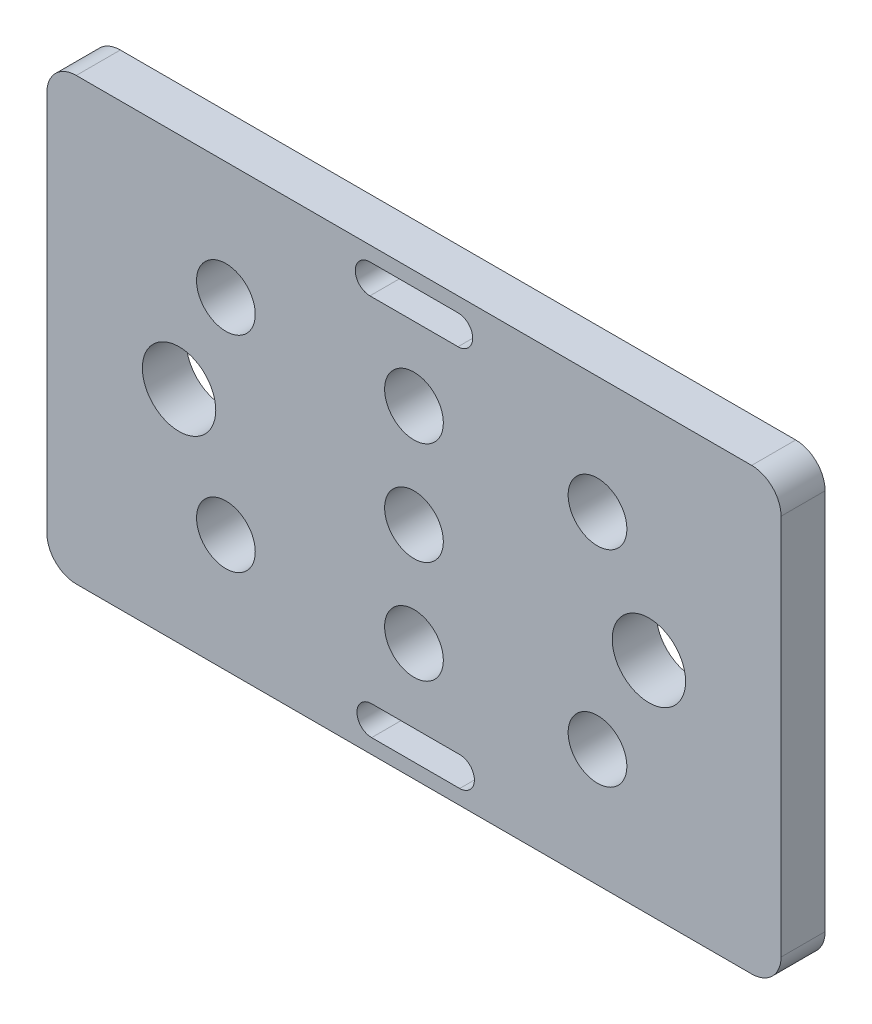
ISO-10303-21;
HEADER;
FILE_DESCRIPTION(('STEP AP214'),'2;1');
FILE_NAME('part.step','',(''),(''),'','','');
FILE_SCHEMA(('AUTOMOTIVE_DESIGN { 1 0 10303 214 1 1 1 1 }'));
ENDSEC;
DATA;
#1=APPLICATION_CONTEXT('core data for automotive mechanical design processes');
#2=APPLICATION_PROTOCOL_DEFINITION('international standard','automotive_design',2000,#1);
#3=PRODUCT_CONTEXT('',#1,'mechanical');
#4=PRODUCT('Part','Part','',(#3));
#5=PRODUCT_RELATED_PRODUCT_CATEGORY('part','',(#4));
#6=PRODUCT_DEFINITION_FORMATION('','',#4);
#7=PRODUCT_DEFINITION_CONTEXT('part definition',#1,'design');
#8=PRODUCT_DEFINITION('design','',#6,#7);
#9=PRODUCT_DEFINITION_SHAPE('','',#8);
#10=(LENGTH_UNIT() NAMED_UNIT(*) SI_UNIT(.MILLI.,.METRE.));
#11=(NAMED_UNIT(*) PLANE_ANGLE_UNIT() SI_UNIT($,.RADIAN.));
#12=(NAMED_UNIT(*) SI_UNIT($,.STERADIAN.) SOLID_ANGLE_UNIT());
#13=UNCERTAINTY_MEASURE_WITH_UNIT(LENGTH_MEASURE(1.E-05),#10,'distance_accuracy_value','');
#14=(GEOMETRIC_REPRESENTATION_CONTEXT(3) GLOBAL_UNCERTAINTY_ASSIGNED_CONTEXT((#13)) GLOBAL_UNIT_ASSIGNED_CONTEXT((#10,
#11,#12)) REPRESENTATION_CONTEXT('',''));
#15=CARTESIAN_POINT('',(0.,0.,0.));
#16=DIRECTION('',(0.,0.,1.));
#17=DIRECTION('',(1.,0.,0.));
#18=AXIS2_PLACEMENT_3D('',#15,#16,#17);
#19=CARTESIAN_POINT('',(-2.,28.,3.));
#20=DIRECTION('',(0.,0.,1.));
#21=DIRECTION('',(1.,0.,0.));
#22=AXIS2_PLACEMENT_3D('',#19,#20,#21);
#23=PLANE('',#22);
#24=CARTESIAN_POINT('',(-8.99999999999998,15.,3.));
#25=DIRECTION('',(0.,0.,1.));
#26=DIRECTION('',(1.,0.,0.));
#27=AXIS2_PLACEMENT_3D('',#24,#25,#26);
#28=CIRCLE('',#27,2.5);
#29=CARTESIAN_POINT('',(-6.49999999999998,15.,3.));
#30=VERTEX_POINT('',#29);
#31=EDGE_CURVE('E222',#30,#30,#28,.T.);
#32=ORIENTED_EDGE('',*,*,#31,.F.);
#33=EDGE_LOOP('',(#32));
#34=FACE_BOUND('',#33,.T.);
#35=CARTESIAN_POINT('',(-25.,8.,3.));
#36=DIRECTION('',(0.,0.,1.));
#37=DIRECTION('',(1.,0.,0.));
#38=AXIS2_PLACEMENT_3D('',#35,#36,#37);
#39=CIRCLE('',#38,2.);
#40=CARTESIAN_POINT('',(-23.,8.,3.));
#41=VERTEX_POINT('',#40);
#42=EDGE_CURVE('E234',#41,#41,#39,.T.);
#43=ORIENTED_EDGE('',*,*,#42,.F.);
#44=EDGE_LOOP('',(#43));
#45=FACE_BOUND('',#44,.T.);
#46=CARTESIAN_POINT('',(-37.8100565099745,22.,3.));
#47=DIRECTION('',(0.,0.,1.));
#48=DIRECTION('',(1.,0.,0.));
#49=AXIS2_PLACEMENT_3D('',#46,#47,#48);
#50=CIRCLE('',#49,2.);
#51=CARTESIAN_POINT('',(-35.8100565099745,22.,3.));
#52=VERTEX_POINT('',#51);
#53=EDGE_CURVE('E246',#52,#52,#50,.T.);
#54=ORIENTED_EDGE('',*,*,#53,.F.);
#55=EDGE_LOOP('',(#54));
#56=FACE_BOUND('',#55,.T.);
#57=CARTESIAN_POINT('',(-37.8100565099745,7.99999999999999,3.));
#58=DIRECTION('',(0.,0.,1.));
#59=DIRECTION('',(1.,0.,0.));
#60=AXIS2_PLACEMENT_3D('',#57,#58,#59);
#61=CIRCLE('',#60,2.);
#62=CARTESIAN_POINT('',(-35.8100565099745,7.99999999999999,3.));
#63=VERTEX_POINT('',#62);
#64=EDGE_CURVE('E258',#63,#63,#61,.T.);
#65=ORIENTED_EDGE('',*,*,#64,.F.);
#66=EDGE_LOOP('',(#65));
#67=FACE_BOUND('',#66,.T.);
#68=CARTESIAN_POINT('',(-2.,28.,3.));
#69=DIRECTION('',(0.,0.,1.));
#70=DIRECTION('',(1.,0.,0.));
#71=AXIS2_PLACEMENT_3D('',#68,#69,#70);
#72=CIRCLE('',#71,2.);
#73=CARTESIAN_POINT('',(0.,28.,3.));
#74=VERTEX_POINT('',#73);
#75=CARTESIAN_POINT('',(-2.,30.,3.));
#76=VERTEX_POINT('',#75);
#77=EDGE_CURVE('E270',#74,#76,#72,.T.);
#78=ORIENTED_EDGE('',*,*,#77,.T.);
#79=DIRECTION('',(-1.,0.,0.));
#80=VECTOR('',#79,1.);
#81=CARTESIAN_POINT('',(-2.,30.,3.));
#82=LINE('',#81,#80);
#83=CARTESIAN_POINT('',(-48.,30.,3.));
#84=VERTEX_POINT('',#83);
#85=EDGE_CURVE('E273',#76,#84,#82,.T.);
#86=ORIENTED_EDGE('',*,*,#85,.T.);
#87=CARTESIAN_POINT('',(-48.,28.,3.));
#88=DIRECTION('',(0.,0.,1.));
#89=DIRECTION('',(1.,0.,0.));
#90=AXIS2_PLACEMENT_3D('',#87,#88,#89);
#91=CIRCLE('',#90,2.00000000000001);
#92=CARTESIAN_POINT('',(-50.,28.,3.));
#93=VERTEX_POINT('',#92);
#94=EDGE_CURVE('E276',#84,#93,#91,.T.);
#95=ORIENTED_EDGE('',*,*,#94,.T.);
#96=DIRECTION('',(0.,-1.,0.));
#97=VECTOR('',#96,1.);
#98=CARTESIAN_POINT('',(-50.,28.,3.));
#99=LINE('',#98,#97);
#100=CARTESIAN_POINT('',(-50.,1.99999999999997,3.));
#101=VERTEX_POINT('',#100);
#102=EDGE_CURVE('E278',#93,#101,#99,.T.);
#103=ORIENTED_EDGE('',*,*,#102,.T.);
#104=CARTESIAN_POINT('',(-48.,1.99999999999998,3.));
#105=DIRECTION('',(0.,0.,1.));
#106=DIRECTION('',(1.,0.,0.));
#107=AXIS2_PLACEMENT_3D('',#104,#105,#106);
#108=CIRCLE('',#107,2.00000000000001);
#109=CARTESIAN_POINT('',(-48.,0.,3.));
#110=VERTEX_POINT('',#109);
#111=EDGE_CURVE('E280',#101,#110,#108,.T.);
#112=ORIENTED_EDGE('',*,*,#111,.T.);
#113=DIRECTION('',(1.,0.,0.));
#114=VECTOR('',#113,1.);
#115=CARTESIAN_POINT('',(-48.,0.,3.));
#116=LINE('',#115,#114);
#117=CARTESIAN_POINT('',(-2.,0.,3.));
#118=VERTEX_POINT('',#117);
#119=EDGE_CURVE('E282',#110,#118,#116,.T.);
#120=ORIENTED_EDGE('',*,*,#119,.T.);
#121=CARTESIAN_POINT('',(-2.,2.,3.));
#122=DIRECTION('',(0.,0.,1.));
#123=DIRECTION('',(1.,0.,0.));
#124=AXIS2_PLACEMENT_3D('',#121,#122,#123);
#125=CIRCLE('',#124,2.);
#126=CARTESIAN_POINT('',(0.,2.,3.));
#127=VERTEX_POINT('',#126);
#128=EDGE_CURVE('E284',#118,#127,#125,.T.);
#129=ORIENTED_EDGE('',*,*,#128,.T.);
#130=DIRECTION('',(0.,1.,0.));
#131=VECTOR('',#130,1.);
#132=CARTESIAN_POINT('',(0.,2.,3.));
#133=LINE('',#132,#131);
#134=EDGE_CURVE('E286',#127,#74,#133,.T.);
#135=ORIENTED_EDGE('',*,*,#134,.T.);
#136=EDGE_LOOP('',(#78,#86,#95,#103,#112,#120,#129,#135));
#137=FACE_BOUND('',#136,.T.);
#138=CARTESIAN_POINT('',(-25.,15.,3.));
#139=DIRECTION('',(0.,0.,1.));
#140=DIRECTION('',(1.,0.,0.));
#141=AXIS2_PLACEMENT_3D('',#138,#139,#140);
#142=CIRCLE('',#141,2.);
#143=CARTESIAN_POINT('',(-23.,15.,3.));
#144=VERTEX_POINT('',#143);
#145=EDGE_CURVE('E264',#144,#144,#142,.T.);
#146=ORIENTED_EDGE('',*,*,#145,.F.);
#147=EDGE_LOOP('',(#146));
#148=FACE_BOUND('',#147,.T.);
#149=CARTESIAN_POINT('',(-12.5,7.99999999999999,3.));
#150=DIRECTION('',(0.,0.,1.));
#151=DIRECTION('',(1.,0.,0.));
#152=AXIS2_PLACEMENT_3D('',#149,#150,#151);
#153=CIRCLE('',#152,2.);
#154=CARTESIAN_POINT('',(-10.5,7.99999999999999,3.));
#155=VERTEX_POINT('',#154);
#156=EDGE_CURVE('E252',#155,#155,#153,.T.);
#157=ORIENTED_EDGE('',*,*,#156,.F.);
#158=EDGE_LOOP('',(#157));
#159=FACE_BOUND('',#158,.T.);
#160=CARTESIAN_POINT('',(-12.5,22.,3.));
#161=DIRECTION('',(0.,0.,1.));
#162=DIRECTION('',(1.,0.,0.));
#163=AXIS2_PLACEMENT_3D('',#160,#161,#162);
#164=CIRCLE('',#163,2.);
#165=CARTESIAN_POINT('',(-10.5,22.,3.));
#166=VERTEX_POINT('',#165);
#167=EDGE_CURVE('E240',#166,#166,#164,.T.);
#168=ORIENTED_EDGE('',*,*,#167,.F.);
#169=EDGE_LOOP('',(#168));
#170=FACE_BOUND('',#169,.T.);
#171=CARTESIAN_POINT('',(-25.,22.,3.));
#172=DIRECTION('',(0.,0.,1.));
#173=DIRECTION('',(1.,0.,0.));
#174=AXIS2_PLACEMENT_3D('',#171,#172,#173);
#175=CIRCLE('',#174,2.);
#176=CARTESIAN_POINT('',(-23.,22.,3.));
#177=VERTEX_POINT('',#176);
#178=EDGE_CURVE('E228',#177,#177,#175,.T.);
#179=ORIENTED_EDGE('',*,*,#178,.F.);
#180=EDGE_LOOP('',(#179));
#181=FACE_BOUND('',#180,.T.);
#182=CARTESIAN_POINT('',(-41.,15.,3.));
#183=DIRECTION('',(0.,0.,1.));
#184=DIRECTION('',(1.,0.,0.));
#185=AXIS2_PLACEMENT_3D('',#182,#183,#184);
#186=CIRCLE('',#185,2.5);
#187=CARTESIAN_POINT('',(-38.5,15.,3.));
#188=VERTEX_POINT('',#187);
#189=EDGE_CURVE('E216',#188,#188,#186,.T.);
#190=ORIENTED_EDGE('',*,*,#189,.F.);
#191=EDGE_LOOP('',(#190));
#192=FACE_BOUND('',#191,.T.);
#193=DIRECTION('',(-1.,0.,0.));
#194=VECTOR('',#193,1.);
#195=CARTESIAN_POINT('',(-27.8847716320629,2.99999999999998,3.));
#196=LINE('',#195,#194);
#197=CARTESIAN_POINT('',(-21.8847716320629,2.99999999999999,3.));
#198=VERTEX_POINT('',#197);
#199=CARTESIAN_POINT('',(-27.8847716320629,2.99999999999998,3.));
#200=VERTEX_POINT('',#199);
#201=EDGE_CURVE('E187',#198,#200,#196,.T.);
#202=ORIENTED_EDGE('',*,*,#201,.F.);
#203=CARTESIAN_POINT('',(-21.8847716320629,1.99999999999999,3.));
#204=DIRECTION('',(0.,0.,1.));
#205=DIRECTION('',(1.,0.,0.));
#206=AXIS2_PLACEMENT_3D('',#203,#204,#205);
#207=CIRCLE('',#206,1.);
#208=CARTESIAN_POINT('',(-21.8847716320629,0.999999999999986,3.));
#209=VERTEX_POINT('',#208);
#210=EDGE_CURVE('E185',#209,#198,#207,.T.);
#211=ORIENTED_EDGE('',*,*,#210,.F.);
#212=DIRECTION('',(1.,0.,0.));
#213=VECTOR('',#212,1.);
#214=CARTESIAN_POINT('',(-21.8847716320629,0.999999999999986,3.));
#215=LINE('',#214,#213);
#216=CARTESIAN_POINT('',(-27.8847716320629,0.999999999999982,3.));
#217=VERTEX_POINT('',#216);
#218=EDGE_CURVE('E193',#217,#209,#215,.T.);
#219=ORIENTED_EDGE('',*,*,#218,.F.);
#220=CARTESIAN_POINT('',(-27.8847716320629,1.99999999999998,3.));
#221=DIRECTION('',(0.,0.,1.));
#222=DIRECTION('',(1.,0.,0.));
#223=AXIS2_PLACEMENT_3D('',#220,#221,#222);
#224=CIRCLE('',#223,1.);
#225=EDGE_CURVE('E190',#200,#217,#224,.T.);
#226=ORIENTED_EDGE('',*,*,#225,.F.);
#227=EDGE_LOOP('',(#202,#211,#219,#226));
#228=FACE_BOUND('',#227,.T.);
#229=DIRECTION('',(1.,0.,0.));
#230=VECTOR('',#229,1.);
#231=CARTESIAN_POINT('',(-22.,26.9998281085365,3.));
#232=LINE('',#231,#230);
#233=CARTESIAN_POINT('',(-28.,26.9998281085365,3.));
#234=VERTEX_POINT('',#233);
#235=CARTESIAN_POINT('',(-22.,26.9998281085365,3.));
#236=VERTEX_POINT('',#235);
#237=EDGE_CURVE('E157',#234,#236,#232,.T.);
#238=ORIENTED_EDGE('',*,*,#237,.F.);
#239=CARTESIAN_POINT('',(-28.,27.9998281085365,3.));
#240=DIRECTION('',(0.,0.,1.));
#241=DIRECTION('',(1.,0.,0.));
#242=AXIS2_PLACEMENT_3D('',#239,#240,#241);
#243=CIRCLE('',#242,0.999999999999994);
#244=CARTESIAN_POINT('',(-28.,28.9998281085365,3.));
#245=VERTEX_POINT('',#244);
#246=EDGE_CURVE('E149',#245,#234,#243,.T.);
#247=ORIENTED_EDGE('',*,*,#246,.F.);
#248=DIRECTION('',(-1.,0.,0.));
#249=VECTOR('',#248,1.);
#250=CARTESIAN_POINT('',(-28.,28.9998281085365,3.));
#251=LINE('',#250,#249);
#252=CARTESIAN_POINT('',(-22.,28.9998281085365,3.));
#253=VERTEX_POINT('',#252);
#254=EDGE_CURVE('E171',#253,#245,#251,.T.);
#255=ORIENTED_EDGE('',*,*,#254,.F.);
#256=CARTESIAN_POINT('',(-22.,27.9998281085365,3.));
#257=DIRECTION('',(0.,0.,1.));
#258=DIRECTION('',(1.,0.,0.));
#259=AXIS2_PLACEMENT_3D('',#256,#257,#258);
#260=CIRCLE('',#259,1.);
#261=EDGE_CURVE('E169',#236,#253,#260,.T.);
#262=ORIENTED_EDGE('',*,*,#261,.F.);
#263=EDGE_LOOP('',(#238,#247,#255,#262));
#264=FACE_BOUND('',#263,.T.);
#265=ADVANCED_FACE('F36',(#34,#45,#56,#67,#137,#148,#159,#170,#181,#192,#228,#264),#23,.T.);
#266=CARTESIAN_POINT('',(-2.,28.,0.));
#267=DIRECTION('',(0.,0.,1.));
#268=DIRECTION('',(1.,0.,0.));
#269=AXIS2_PLACEMENT_3D('',#266,#267,#268);
#270=PLANE('',#269);
#271=CARTESIAN_POINT('',(-21.8847716320629,1.99999999999999,0.));
#272=DIRECTION('',(0.,0.,1.));
#273=DIRECTION('',(1.,0.,0.));
#274=AXIS2_PLACEMENT_3D('',#271,#272,#273);
#275=CIRCLE('',#274,1.);
#276=CARTESIAN_POINT('',(-21.8847716320629,0.999999999999987,0.));
#277=VERTEX_POINT('',#276);
#278=CARTESIAN_POINT('',(-21.8847716320629,2.99999999999999,0.));
#279=VERTEX_POINT('',#278);
#280=EDGE_CURVE('E165',#277,#279,#275,.T.);
#281=ORIENTED_EDGE('',*,*,#280,.T.);
#282=DIRECTION('',(-1.,0.,0.));
#283=VECTOR('',#282,1.);
#284=CARTESIAN_POINT('',(-27.8847716320629,2.99999999999998,0.));
#285=LINE('',#284,#283);
#286=CARTESIAN_POINT('',(-27.8847716320629,2.99999999999998,0.));
#287=VERTEX_POINT('',#286);
#288=EDGE_CURVE('E198',#279,#287,#285,.T.);
#289=ORIENTED_EDGE('',*,*,#288,.T.);
#290=CARTESIAN_POINT('',(-27.8847716320629,1.99999999999998,0.));
#291=DIRECTION('',(0.,0.,1.));
#292=DIRECTION('',(1.,0.,0.));
#293=AXIS2_PLACEMENT_3D('',#290,#291,#292);
#294=CIRCLE('',#293,1.);
#295=CARTESIAN_POINT('',(-27.8847716320629,0.999999999999981,0.));
#296=VERTEX_POINT('',#295);
#297=EDGE_CURVE('E201',#287,#296,#294,.T.);
#298=ORIENTED_EDGE('',*,*,#297,.T.);
#299=DIRECTION('',(1.,0.,0.));
#300=VECTOR('',#299,1.);
#301=CARTESIAN_POINT('',(-21.8847716320629,0.999999999999986,0.));
#302=LINE('',#301,#300);
#303=EDGE_CURVE('E188',#296,#277,#302,.T.);
#304=ORIENTED_EDGE('',*,*,#303,.T.);
#305=EDGE_LOOP('',(#281,#289,#298,#304));
#306=FACE_BOUND('',#305,.T.);
#307=CARTESIAN_POINT('',(-2.,28.,0.));
#308=DIRECTION('',(0.,0.,1.));
#309=DIRECTION('',(1.,0.,0.));
#310=AXIS2_PLACEMENT_3D('',#307,#308,#309);
#311=CIRCLE('',#310,2.);
#312=CARTESIAN_POINT('',(0.,28.,0.));
#313=VERTEX_POINT('',#312);
#314=CARTESIAN_POINT('',(-2.,30.,0.));
#315=VERTEX_POINT('',#314);
#316=EDGE_CURVE('E267',#313,#315,#311,.T.);
#317=ORIENTED_EDGE('',*,*,#316,.F.);
#318=DIRECTION('',(0.,1.,0.));
#319=VECTOR('',#318,1.);
#320=CARTESIAN_POINT('',(0.,2.,0.));
#321=LINE('',#320,#319);
#322=CARTESIAN_POINT('',(0.,2.,0.));
#323=VERTEX_POINT('',#322);
#324=EDGE_CURVE('E274',#323,#313,#321,.T.);
#325=ORIENTED_EDGE('',*,*,#324,.F.);
#326=CARTESIAN_POINT('',(-2.,2.,0.));
#327=DIRECTION('',(0.,0.,1.));
#328=DIRECTION('',(1.,0.,0.));
#329=AXIS2_PLACEMENT_3D('',#326,#327,#328);
#330=CIRCLE('',#329,2.);
#331=CARTESIAN_POINT('',(-2.,0.,0.));
#332=VERTEX_POINT('',#331);
#333=EDGE_CURVE('E301',#332,#323,#330,.T.);
#334=ORIENTED_EDGE('',*,*,#333,.F.);
#335=DIRECTION('',(1.,0.,0.));
#336=VECTOR('',#335,1.);
#337=CARTESIAN_POINT('',(-48.,0.,0.));
#338=LINE('',#337,#336);
#339=CARTESIAN_POINT('',(-48.,0.,0.));
#340=VERTEX_POINT('',#339);
#341=EDGE_CURVE('E299',#340,#332,#338,.T.);
#342=ORIENTED_EDGE('',*,*,#341,.F.);
#343=CARTESIAN_POINT('',(-48.,1.99999999999998,0.));
#344=DIRECTION('',(0.,0.,1.));
#345=DIRECTION('',(1.,0.,0.));
#346=AXIS2_PLACEMENT_3D('',#343,#344,#345);
#347=CIRCLE('',#346,2.00000000000001);
#348=CARTESIAN_POINT('',(-50.,1.99999999999997,0.));
#349=VERTEX_POINT('',#348);
#350=EDGE_CURVE('E297',#349,#340,#347,.T.);
#351=ORIENTED_EDGE('',*,*,#350,.F.);
#352=DIRECTION('',(0.,-1.,0.));
#353=VECTOR('',#352,1.);
#354=CARTESIAN_POINT('',(-50.,28.,0.));
#355=LINE('',#354,#353);
#356=CARTESIAN_POINT('',(-50.,28.,0.));
#357=VERTEX_POINT('',#356);
#358=EDGE_CURVE('E295',#357,#349,#355,.T.);
#359=ORIENTED_EDGE('',*,*,#358,.F.);
#360=CARTESIAN_POINT('',(-48.,28.,0.));
#361=DIRECTION('',(0.,0.,1.));
#362=DIRECTION('',(1.,0.,0.));
#363=AXIS2_PLACEMENT_3D('',#360,#361,#362);
#364=CIRCLE('',#363,2.00000000000001);
#365=CARTESIAN_POINT('',(-48.,30.,0.));
#366=VERTEX_POINT('',#365);
#367=EDGE_CURVE('E293',#366,#357,#364,.T.);
#368=ORIENTED_EDGE('',*,*,#367,.F.);
#369=DIRECTION('',(-1.,0.,0.));
#370=VECTOR('',#369,1.);
#371=CARTESIAN_POINT('',(-2.,30.,0.));
#372=LINE('',#371,#370);
#373=EDGE_CURVE('E291',#315,#366,#372,.T.);
#374=ORIENTED_EDGE('',*,*,#373,.F.);
#375=EDGE_LOOP('',(#317,#325,#334,#342,#351,#359,#368,#374));
#376=FACE_BOUND('',#375,.T.);
#377=CARTESIAN_POINT('',(-25.,15.,0.));
#378=DIRECTION('',(0.,0.,1.));
#379=DIRECTION('',(1.,0.,0.));
#380=AXIS2_PLACEMENT_3D('',#377,#378,#379);
#381=CIRCLE('',#380,2.);
#382=CARTESIAN_POINT('',(-23.,15.,0.));
#383=VERTEX_POINT('',#382);
#384=EDGE_CURVE('E261',#383,#383,#381,.T.);
#385=ORIENTED_EDGE('',*,*,#384,.T.);
#386=EDGE_LOOP('',(#385));
#387=FACE_BOUND('',#386,.T.);
#388=CARTESIAN_POINT('',(-37.8100565099745,7.99999999999999,0.));
#389=DIRECTION('',(0.,0.,1.));
#390=DIRECTION('',(1.,0.,0.));
#391=AXIS2_PLACEMENT_3D('',#388,#389,#390);
#392=CIRCLE('',#391,2.);
#393=CARTESIAN_POINT('',(-35.8100565099745,7.99999999999999,0.));
#394=VERTEX_POINT('',#393);
#395=EDGE_CURVE('E255',#394,#394,#392,.T.);
#396=ORIENTED_EDGE('',*,*,#395,.T.);
#397=EDGE_LOOP('',(#396));
#398=FACE_BOUND('',#397,.T.);
#399=CARTESIAN_POINT('',(-12.5,7.99999999999999,0.));
#400=DIRECTION('',(0.,0.,1.));
#401=DIRECTION('',(1.,0.,0.));
#402=AXIS2_PLACEMENT_3D('',#399,#400,#401);
#403=CIRCLE('',#402,2.);
#404=CARTESIAN_POINT('',(-10.5,7.99999999999999,0.));
#405=VERTEX_POINT('',#404);
#406=EDGE_CURVE('E249',#405,#405,#403,.T.);
#407=ORIENTED_EDGE('',*,*,#406,.T.);
#408=EDGE_LOOP('',(#407));
#409=FACE_BOUND('',#408,.T.);
#410=CARTESIAN_POINT('',(-37.8100565099745,22.,0.));
#411=DIRECTION('',(0.,0.,1.));
#412=DIRECTION('',(1.,0.,0.));
#413=AXIS2_PLACEMENT_3D('',#410,#411,#412);
#414=CIRCLE('',#413,2.);
#415=CARTESIAN_POINT('',(-35.8100565099745,22.,0.));
#416=VERTEX_POINT('',#415);
#417=EDGE_CURVE('E243',#416,#416,#414,.T.);
#418=ORIENTED_EDGE('',*,*,#417,.T.);
#419=EDGE_LOOP('',(#418));
#420=FACE_BOUND('',#419,.T.);
#421=CARTESIAN_POINT('',(-12.5,22.,0.));
#422=DIRECTION('',(0.,0.,1.));
#423=DIRECTION('',(1.,0.,0.));
#424=AXIS2_PLACEMENT_3D('',#421,#422,#423);
#425=CIRCLE('',#424,2.);
#426=CARTESIAN_POINT('',(-10.5,22.,0.));
#427=VERTEX_POINT('',#426);
#428=EDGE_CURVE('E237',#427,#427,#425,.T.);
#429=ORIENTED_EDGE('',*,*,#428,.T.);
#430=EDGE_LOOP('',(#429));
#431=FACE_BOUND('',#430,.T.);
#432=CARTESIAN_POINT('',(-25.,8.,0.));
#433=DIRECTION('',(0.,0.,1.));
#434=DIRECTION('',(1.,0.,0.));
#435=AXIS2_PLACEMENT_3D('',#432,#433,#434);
#436=CIRCLE('',#435,2.);
#437=CARTESIAN_POINT('',(-23.,8.,0.));
#438=VERTEX_POINT('',#437);
#439=EDGE_CURVE('E231',#438,#438,#436,.T.);
#440=ORIENTED_EDGE('',*,*,#439,.T.);
#441=EDGE_LOOP('',(#440));
#442=FACE_BOUND('',#441,.T.);
#443=CARTESIAN_POINT('',(-25.,22.,0.));
#444=DIRECTION('',(0.,0.,1.));
#445=DIRECTION('',(1.,0.,0.));
#446=AXIS2_PLACEMENT_3D('',#443,#444,#445);
#447=CIRCLE('',#446,2.);
#448=CARTESIAN_POINT('',(-23.,22.,0.));
#449=VERTEX_POINT('',#448);
#450=EDGE_CURVE('E225',#449,#449,#447,.T.);
#451=ORIENTED_EDGE('',*,*,#450,.T.);
#452=EDGE_LOOP('',(#451));
#453=FACE_BOUND('',#452,.T.);
#454=CARTESIAN_POINT('',(-8.99999999999998,15.,0.));
#455=DIRECTION('',(0.,0.,1.));
#456=DIRECTION('',(1.,0.,0.));
#457=AXIS2_PLACEMENT_3D('',#454,#455,#456);
#458=CIRCLE('',#457,2.5);
#459=CARTESIAN_POINT('',(-6.49999999999998,15.,0.));
#460=VERTEX_POINT('',#459);
#461=EDGE_CURVE('E219',#460,#460,#458,.T.);
#462=ORIENTED_EDGE('',*,*,#461,.T.);
#463=EDGE_LOOP('',(#462));
#464=FACE_BOUND('',#463,.T.);
#465=CARTESIAN_POINT('',(-41.,15.,0.));
#466=DIRECTION('',(0.,0.,1.));
#467=DIRECTION('',(1.,0.,0.));
#468=AXIS2_PLACEMENT_3D('',#465,#466,#467);
#469=CIRCLE('',#468,2.5);
#470=CARTESIAN_POINT('',(-38.5,15.,0.));
#471=VERTEX_POINT('',#470);
#472=EDGE_CURVE('E215',#471,#471,#469,.T.);
#473=ORIENTED_EDGE('',*,*,#472,.T.);
#474=EDGE_LOOP('',(#473));
#475=FACE_BOUND('',#474,.T.);
#476=CARTESIAN_POINT('',(-28.,27.9998281085365,0.));
#477=DIRECTION('',(0.,0.,1.));
#478=DIRECTION('',(1.,0.,0.));
#479=AXIS2_PLACEMENT_3D('',#476,#477,#478);
#480=CIRCLE('',#479,0.999999999999994);
#481=CARTESIAN_POINT('',(-28.,28.9998281085365,0.));
#482=VERTEX_POINT('',#481);
#483=CARTESIAN_POINT('',(-28.,26.9998281085365,0.));
#484=VERTEX_POINT('',#483);
#485=EDGE_CURVE('E59',#482,#484,#480,.T.);
#486=ORIENTED_EDGE('',*,*,#485,.T.);
#487=DIRECTION('',(1.,0.,0.));
#488=VECTOR('',#487,1.);
#489=CARTESIAN_POINT('',(-22.,26.9998281085365,0.));
#490=LINE('',#489,#488);
#491=CARTESIAN_POINT('',(-22.,26.9998281085365,0.));
#492=VERTEX_POINT('',#491);
#493=EDGE_CURVE('E164',#484,#492,#490,.T.);
#494=ORIENTED_EDGE('',*,*,#493,.T.);
#495=CARTESIAN_POINT('',(-22.,27.9998281085365,0.));
#496=DIRECTION('',(0.,0.,1.));
#497=DIRECTION('',(1.,0.,0.));
#498=AXIS2_PLACEMENT_3D('',#495,#496,#497);
#499=CIRCLE('',#498,1.);
#500=CARTESIAN_POINT('',(-22.,28.9998281085365,0.));
#501=VERTEX_POINT('',#500);
#502=EDGE_CURVE('E177',#492,#501,#499,.T.);
#503=ORIENTED_EDGE('',*,*,#502,.T.);
#504=DIRECTION('',(-1.,0.,0.));
#505=VECTOR('',#504,1.);
#506=CARTESIAN_POINT('',(-28.,28.9998281085365,0.));
#507=LINE('',#506,#505);
#508=EDGE_CURVE('E158',#501,#482,#507,.T.);
#509=ORIENTED_EDGE('',*,*,#508,.T.);
#510=EDGE_LOOP('',(#486,#494,#503,#509));
#511=FACE_BOUND('',#510,.T.);
#512=ADVANCED_FACE('F331',(#306,#376,#387,#398,#409,#420,#431,#442,#453,#464,#475,#511),#270,.F.);
#513=CARTESIAN_POINT('',(-2.,28.,3.));
#514=DIRECTION('',(0.,0.,-1.));
#515=DIRECTION('',(-1.,0.,0.));
#516=AXIS2_PLACEMENT_3D('',#513,#514,#515);
#517=CYLINDRICAL_SURFACE('',#516,2.);
#518=ORIENTED_EDGE('',*,*,#316,.T.);
#519=DIRECTION('',(0.,0.,-1.));
#520=VECTOR('',#519,1.);
#521=CARTESIAN_POINT('',(-2.,30.,3.));
#522=LINE('',#521,#520);
#523=EDGE_CURVE('E11',#76,#315,#522,.T.);
#524=ORIENTED_EDGE('',*,*,#523,.F.);
#525=ORIENTED_EDGE('',*,*,#77,.F.);
#526=DIRECTION('',(0.,0.,-1.));
#527=VECTOR('',#526,1.);
#528=CARTESIAN_POINT('',(0.,28.,3.));
#529=LINE('',#528,#527);
#530=EDGE_CURVE('E288',#74,#313,#529,.T.);
#531=ORIENTED_EDGE('',*,*,#530,.T.);
#532=EDGE_LOOP('',(#518,#524,#525,#531));
#533=FACE_BOUND('',#532,.T.);
#534=ADVANCED_FACE('F38',(#533),#517,.T.);
#535=CARTESIAN_POINT('',(-2.,30.,3.));
#536=DIRECTION('',(0.,-1.,0.));
#537=DIRECTION('',(1.,0.,0.));
#538=AXIS2_PLACEMENT_3D('',#535,#536,#537);
#539=PLANE('',#538);
#540=ORIENTED_EDGE('',*,*,#373,.T.);
#541=DIRECTION('',(0.,0.,-1.));
#542=VECTOR('',#541,1.);
#543=CARTESIAN_POINT('',(-48.,30.,3.));
#544=LINE('',#543,#542);
#545=EDGE_CURVE('E44',#84,#366,#544,.T.);
#546=ORIENTED_EDGE('',*,*,#545,.F.);
#547=ORIENTED_EDGE('',*,*,#85,.F.);
#548=ORIENTED_EDGE('',*,*,#523,.T.);
#549=EDGE_LOOP('',(#540,#546,#547,#548));
#550=FACE_BOUND('',#549,.T.);
#551=ADVANCED_FACE('F349',(#550),#539,.F.);
#552=CARTESIAN_POINT('',(-48.,28.,3.));
#553=DIRECTION('',(0.,0.,-1.));
#554=DIRECTION('',(-1.,0.,0.));
#555=AXIS2_PLACEMENT_3D('',#552,#553,#554);
#556=CYLINDRICAL_SURFACE('',#555,2.00000000000001);
#557=ORIENTED_EDGE('',*,*,#367,.T.);
#558=DIRECTION('',(0.,0.,-1.));
#559=VECTOR('',#558,1.);
#560=CARTESIAN_POINT('',(-50.,28.,3.));
#561=LINE('',#560,#559);
#562=EDGE_CURVE('E318',#93,#357,#561,.T.);
#563=ORIENTED_EDGE('',*,*,#562,.F.);
#564=ORIENTED_EDGE('',*,*,#94,.F.);
#565=ORIENTED_EDGE('',*,*,#545,.T.);
#566=EDGE_LOOP('',(#557,#563,#564,#565));
#567=FACE_BOUND('',#566,.T.);
#568=ADVANCED_FACE('F325',(#567),#556,.T.);
#569=CARTESIAN_POINT('',(-50.,28.,3.));
#570=DIRECTION('',(1.,0.,0.));
#571=DIRECTION('',(0.,0.,-1.));
#572=AXIS2_PLACEMENT_3D('',#569,#570,#571);
#573=PLANE('',#572);
#574=ORIENTED_EDGE('',*,*,#358,.T.);
#575=DIRECTION('',(0.,0.,-1.));
#576=VECTOR('',#575,1.);
#577=CARTESIAN_POINT('',(-50.,1.99999999999997,3.));
#578=LINE('',#577,#576);
#579=EDGE_CURVE('E315',#101,#349,#578,.T.);
#580=ORIENTED_EDGE('',*,*,#579,.F.);
#581=ORIENTED_EDGE('',*,*,#102,.F.);
#582=ORIENTED_EDGE('',*,*,#562,.T.);
#583=EDGE_LOOP('',(#574,#580,#581,#582));
#584=FACE_BOUND('',#583,.T.);
#585=ADVANCED_FACE('F337',(#584),#573,.F.);
#586=CARTESIAN_POINT('',(-48.,1.99999999999998,3.));
#587=DIRECTION('',(0.,0.,-1.));
#588=DIRECTION('',(-1.,0.,0.));
#589=AXIS2_PLACEMENT_3D('',#586,#587,#588);
#590=CYLINDRICAL_SURFACE('',#589,2.00000000000001);
#591=ORIENTED_EDGE('',*,*,#350,.T.);
#592=DIRECTION('',(0.,0.,-1.));
#593=VECTOR('',#592,1.);
#594=CARTESIAN_POINT('',(-48.,0.,3.));
#595=LINE('',#594,#593);
#596=EDGE_CURVE('E312',#110,#340,#595,.T.);
#597=ORIENTED_EDGE('',*,*,#596,.F.);
#598=ORIENTED_EDGE('',*,*,#111,.F.);
#599=ORIENTED_EDGE('',*,*,#579,.T.);
#600=EDGE_LOOP('',(#591,#597,#598,#599));
#601=FACE_BOUND('',#600,.T.);
#602=ADVANCED_FACE('F341',(#601),#590,.T.);
#603=CARTESIAN_POINT('',(-48.,0.,3.));
#604=DIRECTION('',(0.,1.,0.));
#605=DIRECTION('',(-1.,0.,0.));
#606=AXIS2_PLACEMENT_3D('',#603,#604,#605);
#607=PLANE('',#606);
#608=ORIENTED_EDGE('',*,*,#341,.T.);
#609=DIRECTION('',(0.,0.,-1.));
#610=VECTOR('',#609,1.);
#611=CARTESIAN_POINT('',(-2.,0.,3.));
#612=LINE('',#611,#610);
#613=EDGE_CURVE('E309',#118,#332,#612,.T.);
#614=ORIENTED_EDGE('',*,*,#613,.F.);
#615=ORIENTED_EDGE('',*,*,#119,.F.);
#616=ORIENTED_EDGE('',*,*,#596,.T.);
#617=EDGE_LOOP('',(#608,#614,#615,#616));
#618=FACE_BOUND('',#617,.T.);
#619=ADVANCED_FACE('F362',(#618),#607,.F.);
#620=CARTESIAN_POINT('',(-2.,2.,3.));
#621=DIRECTION('',(0.,0.,-1.));
#622=DIRECTION('',(-1.,0.,0.));
#623=AXIS2_PLACEMENT_3D('',#620,#621,#622);
#624=CYLINDRICAL_SURFACE('',#623,2.);
#625=ORIENTED_EDGE('',*,*,#333,.T.);
#626=DIRECTION('',(0.,0.,-1.));
#627=VECTOR('',#626,1.);
#628=CARTESIAN_POINT('',(0.,2.,3.));
#629=LINE('',#628,#627);
#630=EDGE_CURVE('E306',#127,#323,#629,.T.);
#631=ORIENTED_EDGE('',*,*,#630,.F.);
#632=ORIENTED_EDGE('',*,*,#128,.F.);
#633=ORIENTED_EDGE('',*,*,#613,.T.);
#634=EDGE_LOOP('',(#625,#631,#632,#633));
#635=FACE_BOUND('',#634,.T.);
#636=ADVANCED_FACE('F360',(#635),#624,.T.);
#637=CARTESIAN_POINT('',(0.,2.,3.));
#638=DIRECTION('',(-1.,0.,0.));
#639=DIRECTION('',(0.,-1.,0.));
#640=AXIS2_PLACEMENT_3D('',#637,#638,#639);
#641=PLANE('',#640);
#642=ORIENTED_EDGE('',*,*,#324,.T.);
#643=ORIENTED_EDGE('',*,*,#530,.F.);
#644=ORIENTED_EDGE('',*,*,#134,.F.);
#645=ORIENTED_EDGE('',*,*,#630,.T.);
#646=EDGE_LOOP('',(#642,#643,#644,#645));
#647=FACE_BOUND('',#646,.T.);
#648=ADVANCED_FACE('F355',(#647),#641,.F.);
#649=CARTESIAN_POINT('',(-25.,15.,3.));
#650=DIRECTION('',(0.,0.,-1.));
#651=DIRECTION('',(-1.,0.,0.));
#652=AXIS2_PLACEMENT_3D('',#649,#650,#651);
#653=CYLINDRICAL_SURFACE('',#652,2.);
#654=ORIENTED_EDGE('',*,*,#145,.T.);
#655=EDGE_LOOP('',(#654));
#656=FACE_BOUND('',#655,.T.);
#657=ORIENTED_EDGE('',*,*,#384,.F.);
#658=EDGE_LOOP('',(#657));
#659=FACE_BOUND('',#658,.T.);
#660=ADVANCED_FACE('F382',(#656,#659),#653,.F.);
#661=CARTESIAN_POINT('',(-37.8100565099745,7.99999999999999,3.));
#662=DIRECTION('',(0.,0.,-1.));
#663=DIRECTION('',(-1.,0.,0.));
#664=AXIS2_PLACEMENT_3D('',#661,#662,#663);
#665=CYLINDRICAL_SURFACE('',#664,2.);
#666=ORIENTED_EDGE('',*,*,#64,.T.);
#667=EDGE_LOOP('',(#666));
#668=FACE_BOUND('',#667,.T.);
#669=ORIENTED_EDGE('',*,*,#395,.F.);
#670=EDGE_LOOP('',(#669));
#671=FACE_BOUND('',#670,.T.);
#672=ADVANCED_FACE('F389',(#668,#671),#665,.F.);
#673=CARTESIAN_POINT('',(-12.5,7.99999999999999,3.));
#674=DIRECTION('',(0.,0.,-1.));
#675=DIRECTION('',(-1.,0.,0.));
#676=AXIS2_PLACEMENT_3D('',#673,#674,#675);
#677=CYLINDRICAL_SURFACE('',#676,2.);
#678=ORIENTED_EDGE('',*,*,#156,.T.);
#679=EDGE_LOOP('',(#678));
#680=FACE_BOUND('',#679,.T.);
#681=ORIENTED_EDGE('',*,*,#406,.F.);
#682=EDGE_LOOP('',(#681));
#683=FACE_BOUND('',#682,.T.);
#684=ADVANCED_FACE('F394',(#680,#683),#677,.F.);
#685=CARTESIAN_POINT('',(-37.8100565099745,22.,3.));
#686=DIRECTION('',(0.,0.,-1.));
#687=DIRECTION('',(-1.,0.,0.));
#688=AXIS2_PLACEMENT_3D('',#685,#686,#687);
#689=CYLINDRICAL_SURFACE('',#688,2.);
#690=ORIENTED_EDGE('',*,*,#53,.T.);
#691=EDGE_LOOP('',(#690));
#692=FACE_BOUND('',#691,.T.);
#693=ORIENTED_EDGE('',*,*,#417,.F.);
#694=EDGE_LOOP('',(#693));
#695=FACE_BOUND('',#694,.T.);
#696=ADVANCED_FACE('F466',(#692,#695),#689,.F.);
#697=CARTESIAN_POINT('',(-12.5,22.,3.));
#698=DIRECTION('',(0.,0.,-1.));
#699=DIRECTION('',(-1.,0.,0.));
#700=AXIS2_PLACEMENT_3D('',#697,#698,#699);
#701=CYLINDRICAL_SURFACE('',#700,2.);
#702=ORIENTED_EDGE('',*,*,#167,.T.);
#703=EDGE_LOOP('',(#702));
#704=FACE_BOUND('',#703,.T.);
#705=ORIENTED_EDGE('',*,*,#428,.F.);
#706=EDGE_LOOP('',(#705));
#707=FACE_BOUND('',#706,.T.);
#708=ADVANCED_FACE('F462',(#704,#707),#701,.F.);
#709=CARTESIAN_POINT('',(-25.,8.,3.));
#710=DIRECTION('',(0.,0.,-1.));
#711=DIRECTION('',(-1.,0.,0.));
#712=AXIS2_PLACEMENT_3D('',#709,#710,#711);
#713=CYLINDRICAL_SURFACE('',#712,2.);
#714=ORIENTED_EDGE('',*,*,#42,.T.);
#715=EDGE_LOOP('',(#714));
#716=FACE_BOUND('',#715,.T.);
#717=ORIENTED_EDGE('',*,*,#439,.F.);
#718=EDGE_LOOP('',(#717));
#719=FACE_BOUND('',#718,.T.);
#720=ADVANCED_FACE('F458',(#716,#719),#713,.F.);
#721=CARTESIAN_POINT('',(-25.,22.,3.));
#722=DIRECTION('',(0.,0.,-1.));
#723=DIRECTION('',(-1.,0.,0.));
#724=AXIS2_PLACEMENT_3D('',#721,#722,#723);
#725=CYLINDRICAL_SURFACE('',#724,2.);
#726=ORIENTED_EDGE('',*,*,#178,.T.);
#727=EDGE_LOOP('',(#726));
#728=FACE_BOUND('',#727,.T.);
#729=ORIENTED_EDGE('',*,*,#450,.F.);
#730=EDGE_LOOP('',(#729));
#731=FACE_BOUND('',#730,.T.);
#732=ADVANCED_FACE('F454',(#728,#731),#725,.F.);
#733=CARTESIAN_POINT('',(-8.99999999999998,15.,3.));
#734=DIRECTION('',(0.,0.,-1.));
#735=DIRECTION('',(-1.,0.,0.));
#736=AXIS2_PLACEMENT_3D('',#733,#734,#735);
#737=CYLINDRICAL_SURFACE('',#736,2.5);
#738=ORIENTED_EDGE('',*,*,#31,.T.);
#739=EDGE_LOOP('',(#738));
#740=FACE_BOUND('',#739,.T.);
#741=ORIENTED_EDGE('',*,*,#461,.F.);
#742=EDGE_LOOP('',(#741));
#743=FACE_BOUND('',#742,.T.);
#744=ADVANCED_FACE('F450',(#740,#743),#737,.F.);
#745=CARTESIAN_POINT('',(-41.,15.,3.));
#746=DIRECTION('',(0.,0.,-1.));
#747=DIRECTION('',(-1.,0.,0.));
#748=AXIS2_PLACEMENT_3D('',#745,#746,#747);
#749=CYLINDRICAL_SURFACE('',#748,2.5);
#750=ORIENTED_EDGE('',*,*,#189,.T.);
#751=EDGE_LOOP('',(#750));
#752=FACE_BOUND('',#751,.T.);
#753=ORIENTED_EDGE('',*,*,#472,.F.);
#754=EDGE_LOOP('',(#753));
#755=FACE_BOUND('',#754,.T.);
#756=ADVANCED_FACE('F446',(#752,#755),#749,.F.);
#757=CARTESIAN_POINT('',(-21.8847716320629,1.99999999999999,3.));
#758=DIRECTION('',(0.,0.,-1.));
#759=DIRECTION('',(-1.,0.,0.));
#760=AXIS2_PLACEMENT_3D('',#757,#758,#759);
#761=CYLINDRICAL_SURFACE('',#760,1.);
#762=ORIENTED_EDGE('',*,*,#280,.F.);
#763=DIRECTION('',(0.,0.,-1.));
#764=VECTOR('',#763,1.);
#765=CARTESIAN_POINT('',(-21.8847716320629,0.999999999999986,3.));
#766=LINE('',#765,#764);
#767=EDGE_CURVE('E195',#209,#277,#766,.T.);
#768=ORIENTED_EDGE('',*,*,#767,.F.);
#769=ORIENTED_EDGE('',*,*,#210,.T.);
#770=DIRECTION('',(0.,0.,-1.));
#771=VECTOR('',#770,1.);
#772=CARTESIAN_POINT('',(-21.8847716320629,2.99999999999999,3.));
#773=LINE('',#772,#771);
#774=EDGE_CURVE('E212',#198,#279,#773,.T.);
#775=ORIENTED_EDGE('',*,*,#774,.T.);
#776=EDGE_LOOP('',(#762,#768,#769,#775));
#777=FACE_BOUND('',#776,.T.);
#778=ADVANCED_FACE('F442',(#777),#761,.F.);
#779=CARTESIAN_POINT('',(-27.8847716320629,2.99999999999998,3.));
#780=DIRECTION('',(0.,-1.,0.));
#781=DIRECTION('',(1.,0.,0.));
#782=AXIS2_PLACEMENT_3D('',#779,#780,#781);
#783=PLANE('',#782);
#784=ORIENTED_EDGE('',*,*,#288,.F.);
#785=ORIENTED_EDGE('',*,*,#774,.F.);
#786=ORIENTED_EDGE('',*,*,#201,.T.);
#787=DIRECTION('',(0.,0.,-1.));
#788=VECTOR('',#787,1.);
#789=CARTESIAN_POINT('',(-27.8847716320629,2.99999999999998,3.));
#790=LINE('',#789,#788);
#791=EDGE_CURVE('E210',#200,#287,#790,.T.);
#792=ORIENTED_EDGE('',*,*,#791,.T.);
#793=EDGE_LOOP('',(#784,#785,#786,#792));
#794=FACE_BOUND('',#793,.T.);
#795=ADVANCED_FACE('F438',(#794),#783,.T.);
#796=CARTESIAN_POINT('',(-27.8847716320629,1.99999999999998,3.));
#797=DIRECTION('',(0.,0.,-1.));
#798=DIRECTION('',(-1.,0.,0.));
#799=AXIS2_PLACEMENT_3D('',#796,#797,#798);
#800=CYLINDRICAL_SURFACE('',#799,1.);
#801=ORIENTED_EDGE('',*,*,#297,.F.);
#802=ORIENTED_EDGE('',*,*,#791,.F.);
#803=ORIENTED_EDGE('',*,*,#225,.T.);
#804=DIRECTION('',(0.,0.,-1.));
#805=VECTOR('',#804,1.);
#806=CARTESIAN_POINT('',(-27.8847716320629,0.999999999999981,3.));
#807=LINE('',#806,#805);
#808=EDGE_CURVE('E208',#217,#296,#807,.T.);
#809=ORIENTED_EDGE('',*,*,#808,.T.);
#810=EDGE_LOOP('',(#801,#802,#803,#809));
#811=FACE_BOUND('',#810,.T.);
#812=ADVANCED_FACE('F434',(#811),#800,.F.);
#813=CARTESIAN_POINT('',(-21.8847716320629,0.999999999999986,3.));
#814=DIRECTION('',(0.,1.,0.));
#815=DIRECTION('',(-1.,0.,0.));
#816=AXIS2_PLACEMENT_3D('',#813,#814,#815);
#817=PLANE('',#816);
#818=ORIENTED_EDGE('',*,*,#303,.F.);
#819=ORIENTED_EDGE('',*,*,#808,.F.);
#820=ORIENTED_EDGE('',*,*,#218,.T.);
#821=ORIENTED_EDGE('',*,*,#767,.T.);
#822=EDGE_LOOP('',(#818,#819,#820,#821));
#823=FACE_BOUND('',#822,.T.);
#824=ADVANCED_FACE('F431',(#823),#817,.T.);
#825=CARTESIAN_POINT('',(-28.,27.9998281085365,3.));
#826=DIRECTION('',(0.,0.,-1.));
#827=DIRECTION('',(-1.,0.,0.));
#828=AXIS2_PLACEMENT_3D('',#825,#826,#827);
#829=CYLINDRICAL_SURFACE('',#828,0.999999999999994);
#830=ORIENTED_EDGE('',*,*,#485,.F.);
#831=DIRECTION('',(0.,0.,-1.));
#832=VECTOR('',#831,1.);
#833=CARTESIAN_POINT('',(-28.,28.9998281085365,3.));
#834=LINE('',#833,#832);
#835=EDGE_CURVE('E153',#245,#482,#834,.T.);
#836=ORIENTED_EDGE('',*,*,#835,.F.);
#837=ORIENTED_EDGE('',*,*,#246,.T.);
#838=DIRECTION('',(0.,0.,-1.));
#839=VECTOR('',#838,1.);
#840=CARTESIAN_POINT('',(-28.,26.9998281085365,3.));
#841=LINE('',#840,#839);
#842=EDGE_CURVE('E152',#234,#484,#841,.T.);
#843=ORIENTED_EDGE('',*,*,#842,.T.);
#844=EDGE_LOOP('',(#830,#836,#837,#843));
#845=FACE_BOUND('',#844,.T.);
#846=ADVANCED_FACE('F151',(#845),#829,.F.);
#847=CARTESIAN_POINT('',(-22.,26.9998281085365,3.));
#848=DIRECTION('',(0.,1.,0.));
#849=DIRECTION('',(0.,0.,1.));
#850=AXIS2_PLACEMENT_3D('',#847,#848,#849);
#851=PLANE('',#850);
#852=ORIENTED_EDGE('',*,*,#493,.F.);
#853=ORIENTED_EDGE('',*,*,#842,.F.);
#854=ORIENTED_EDGE('',*,*,#237,.T.);
#855=DIRECTION('',(0.,0.,-1.));
#856=VECTOR('',#855,1.);
#857=CARTESIAN_POINT('',(-22.,26.9998281085365,3.));
#858=LINE('',#857,#856);
#859=EDGE_CURVE('E166',#236,#492,#858,.T.);
#860=ORIENTED_EDGE('',*,*,#859,.T.);
#861=EDGE_LOOP('',(#852,#853,#854,#860));
#862=FACE_BOUND('',#861,.T.);
#863=ADVANCED_FACE('F161',(#862),#851,.T.);
#864=CARTESIAN_POINT('',(-22.,27.9998281085365,3.));
#865=DIRECTION('',(0.,0.,-1.));
#866=DIRECTION('',(-1.,0.,0.));
#867=AXIS2_PLACEMENT_3D('',#864,#865,#866);
#868=CYLINDRICAL_SURFACE('',#867,1.);
#869=ORIENTED_EDGE('',*,*,#502,.F.);
#870=ORIENTED_EDGE('',*,*,#859,.F.);
#871=ORIENTED_EDGE('',*,*,#261,.T.);
#872=DIRECTION('',(0.,0.,-1.));
#873=VECTOR('',#872,1.);
#874=CARTESIAN_POINT('',(-22.,28.9998281085365,3.));
#875=LINE('',#874,#873);
#876=EDGE_CURVE('E51',#253,#501,#875,.T.);
#877=ORIENTED_EDGE('',*,*,#876,.T.);
#878=EDGE_LOOP('',(#869,#870,#871,#877));
#879=FACE_BOUND('',#878,.T.);
#880=ADVANCED_FACE('F419',(#879),#868,.F.);
#881=CARTESIAN_POINT('',(-28.,28.9998281085365,3.));
#882=DIRECTION('',(0.,-1.,0.));
#883=DIRECTION('',(1.,0.,0.));
#884=AXIS2_PLACEMENT_3D('',#881,#882,#883);
#885=PLANE('',#884);
#886=ORIENTED_EDGE('',*,*,#508,.F.);
#887=ORIENTED_EDGE('',*,*,#876,.F.);
#888=ORIENTED_EDGE('',*,*,#254,.T.);
#889=ORIENTED_EDGE('',*,*,#835,.T.);
#890=EDGE_LOOP('',(#886,#887,#888,#889));
#891=FACE_BOUND('',#890,.T.);
#892=ADVANCED_FACE('F417',(#891),#885,.T.);
#893=CLOSED_SHELL('',(#265,#512,#534,#551,#568,#585,#602,#619,#636,#648,#660,#672,#684,#696,
#708,#720,#732,#744,#756,#778,#795,#812,#824,#846,#863,#880,#892));
#894=MANIFOLD_SOLID_BREP('B2',#893);
#895=ADVANCED_BREP_SHAPE_REPRESENTATION('',(#18,#894),#14);
#896=SHAPE_DEFINITION_REPRESENTATION(#9,#895);
ENDSEC;
END-ISO-10303-21;
